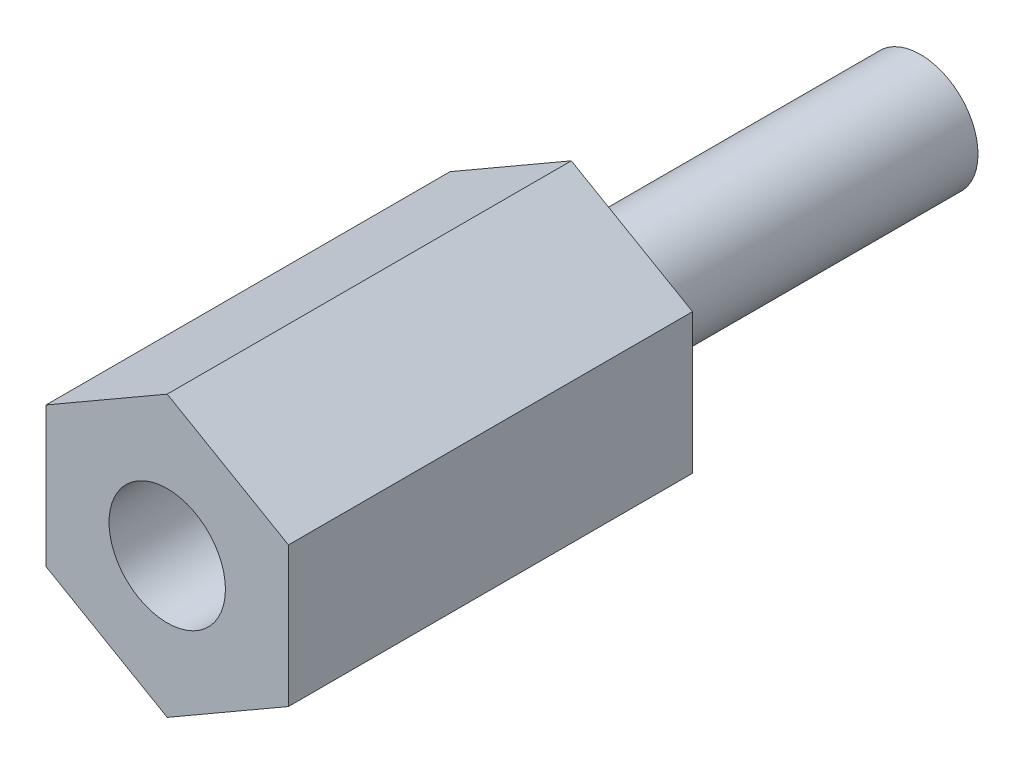
ISO-10303-21;
HEADER;
FILE_DESCRIPTION(('STEP AP214'),'2;1');
FILE_NAME('part.step','',(''),(''),'','','');
FILE_SCHEMA(('AUTOMOTIVE_DESIGN { 1 0 10303 214 1 1 1 1 }'));
ENDSEC;
DATA;
#1=APPLICATION_CONTEXT('core data for automotive mechanical design processes');
#2=APPLICATION_PROTOCOL_DEFINITION('international standard','automotive_design',2000,#1);
#3=PRODUCT_CONTEXT('',#1,'mechanical');
#4=PRODUCT('Part','Part','',(#3));
#5=PRODUCT_RELATED_PRODUCT_CATEGORY('part','',(#4));
#6=PRODUCT_DEFINITION_FORMATION('','',#4);
#7=PRODUCT_DEFINITION_CONTEXT('part definition',#1,'design');
#8=PRODUCT_DEFINITION('design','',#6,#7);
#9=PRODUCT_DEFINITION_SHAPE('','',#8);
#10=(LENGTH_UNIT() NAMED_UNIT(*) SI_UNIT(.MILLI.,.METRE.));
#11=(NAMED_UNIT(*) PLANE_ANGLE_UNIT() SI_UNIT($,.RADIAN.));
#12=(NAMED_UNIT(*) SI_UNIT($,.STERADIAN.) SOLID_ANGLE_UNIT());
#13=UNCERTAINTY_MEASURE_WITH_UNIT(LENGTH_MEASURE(1.E-05),#10,'distance_accuracy_value','');
#14=(GEOMETRIC_REPRESENTATION_CONTEXT(3) GLOBAL_UNCERTAINTY_ASSIGNED_CONTEXT((#13)) GLOBAL_UNIT_ASSIGNED_CONTEXT((#10,
#11,#12)) REPRESENTATION_CONTEXT('',''));
#15=CARTESIAN_POINT('',(0.,0.,0.));
#16=DIRECTION('',(0.,0.,1.));
#17=DIRECTION('',(1.,0.,0.));
#18=AXIS2_PLACEMENT_3D('',#15,#16,#17);
#19=CARTESIAN_POINT('',(0.,0.,0.));
#20=DIRECTION('',(0.,0.,1.));
#21=DIRECTION('',(1.,0.,0.));
#22=AXIS2_PLACEMENT_3D('',#19,#20,#21);
#23=PLANE('',#22);
#24=DIRECTION('',(-0.866025403784438,0.500000000000001,0.));
#25=VECTOR('',#24,1.);
#26=CARTESIAN_POINT('',(2.38125,1.3748153285078,0.));
#27=LINE('',#26,#25);
#28=CARTESIAN_POINT('',(2.38125,1.3748153285078,0.));
#29=VERTEX_POINT('',#28);
#30=CARTESIAN_POINT('',(0.,2.74963065701559,0.));
#31=VERTEX_POINT('',#30);
#32=EDGE_CURVE('E120',#29,#31,#27,.T.);
#33=ORIENTED_EDGE('',*,*,#32,.F.);
#34=DIRECTION('',(0.,1.,0.));
#35=VECTOR('',#34,1.);
#36=CARTESIAN_POINT('',(2.38125,-1.37481532850781,0.));
#37=LINE('',#36,#35);
#38=CARTESIAN_POINT('',(2.38125,-1.37481532850781,0.));
#39=VERTEX_POINT('',#38);
#40=EDGE_CURVE('E80',#39,#29,#37,.T.);
#41=ORIENTED_EDGE('',*,*,#40,.F.);
#42=DIRECTION('',(0.866025403784439,0.5,0.));
#43=VECTOR('',#42,1.);
#44=CARTESIAN_POINT('',(0.,-2.74963065701559,0.));
#45=LINE('',#44,#43);
#46=CARTESIAN_POINT('',(0.,-2.74963065701559,0.));
#47=VERTEX_POINT('',#46);
#48=EDGE_CURVE('E74',#47,#39,#45,.T.);
#49=ORIENTED_EDGE('',*,*,#48,.F.);
#50=DIRECTION('',(0.86602540378444,-0.499999999999998,0.));
#51=VECTOR('',#50,1.);
#52=CARTESIAN_POINT('',(-2.38124999999999,-1.3748153285078,0.));
#53=LINE('',#52,#51);
#54=CARTESIAN_POINT('',(-2.38124999999999,-1.3748153285078,0.));
#55=VERTEX_POINT('',#54);
#56=EDGE_CURVE('E110',#55,#47,#53,.T.);
#57=ORIENTED_EDGE('',*,*,#56,.F.);
#58=DIRECTION('',(0.,-1.,0.));
#59=VECTOR('',#58,1.);
#60=CARTESIAN_POINT('',(-2.38124999999999,1.37481532850779,0.));
#61=LINE('',#60,#59);
#62=CARTESIAN_POINT('',(-2.38124999999999,1.37481532850779,0.));
#63=VERTEX_POINT('',#62);
#64=EDGE_CURVE('E126',#63,#55,#61,.T.);
#65=ORIENTED_EDGE('',*,*,#64,.F.);
#66=DIRECTION('',(-0.866025403784438,-0.500000000000001,0.));
#67=VECTOR('',#66,1.);
#68=CARTESIAN_POINT('',(0.,2.74963065701559,0.));
#69=LINE('',#68,#67);
#70=EDGE_CURVE('E123',#31,#63,#69,.T.);
#71=ORIENTED_EDGE('',*,*,#70,.F.);
#72=EDGE_LOOP('',(#33,#41,#49,#57,#65,#71));
#73=FACE_BOUND('',#72,.T.);
#74=CARTESIAN_POINT('',(0.,0.,0.));
#75=DIRECTION('',(0.,0.,1.));
#76=DIRECTION('',(1.,0.,0.));
#77=AXIS2_PLACEMENT_3D('',#74,#75,#76);
#78=CIRCLE('',#77,1.1303);
#79=CARTESIAN_POINT('',(1.1303,0.,0.));
#80=VERTEX_POINT('',#79);
#81=EDGE_CURVE('E11',#80,#80,#78,.F.);
#82=ORIENTED_EDGE('',*,*,#81,.F.);
#83=EDGE_LOOP('',(#82));
#84=FACE_BOUND('',#83,.T.);
#85=ADVANCED_FACE('F34',(#73,#84),#23,.F.);
#86=CARTESIAN_POINT('',(2.38125,1.3748153285078,7.9375));
#87=DIRECTION('',(-0.500000000000001,-0.866025403784438,0.));
#88=DIRECTION('',(0.866025403784438,-0.500000000000001,0.));
#89=AXIS2_PLACEMENT_3D('',#86,#87,#88);
#90=PLANE('',#89);
#91=ORIENTED_EDGE('',*,*,#32,.T.);
#92=DIRECTION('',(0.,0.,-1.));
#93=VECTOR('',#92,1.);
#94=CARTESIAN_POINT('',(0.,2.74963065701559,7.9375));
#95=LINE('',#94,#93);
#96=CARTESIAN_POINT('',(0.,2.74963065701559,7.9375));
#97=VERTEX_POINT('',#96);
#98=EDGE_CURVE('E43',#97,#31,#95,.T.);
#99=ORIENTED_EDGE('',*,*,#98,.F.);
#100=DIRECTION('',(-0.866025403784438,0.500000000000001,0.));
#101=VECTOR('',#100,1.);
#102=CARTESIAN_POINT('',(2.38125,1.3748153285078,7.9375));
#103=LINE('',#102,#101);
#104=CARTESIAN_POINT('',(2.38125,1.3748153285078,7.9375));
#105=VERTEX_POINT('',#104);
#106=EDGE_CURVE('E131',#105,#97,#103,.T.);
#107=ORIENTED_EDGE('',*,*,#106,.F.);
#108=DIRECTION('',(0.,0.,-1.));
#109=VECTOR('',#108,1.);
#110=CARTESIAN_POINT('',(2.38125,1.3748153285078,7.9375));
#111=LINE('',#110,#109);
#112=EDGE_CURVE('E116',#105,#29,#111,.T.);
#113=ORIENTED_EDGE('',*,*,#112,.T.);
#114=EDGE_LOOP('',(#91,#99,#107,#113));
#115=FACE_BOUND('',#114,.T.);
#116=ADVANCED_FACE('F36',(#115),#90,.F.);
#117=CARTESIAN_POINT('',(0.,2.74963065701559,7.9375));
#118=DIRECTION('',(0.500000000000001,-0.866025403784438,0.));
#119=DIRECTION('',(0.866025403784438,0.500000000000001,0.));
#120=AXIS2_PLACEMENT_3D('',#117,#118,#119);
#121=PLANE('',#120);
#122=ORIENTED_EDGE('',*,*,#70,.T.);
#123=DIRECTION('',(0.,0.,-1.));
#124=VECTOR('',#123,1.);
#125=CARTESIAN_POINT('',(-2.38124999999999,1.37481532850779,7.9375));
#126=LINE('',#125,#124);
#127=CARTESIAN_POINT('',(-2.38124999999999,1.37481532850779,7.9375));
#128=VERTEX_POINT('',#127);
#129=EDGE_CURVE('E135',#128,#63,#126,.T.);
#130=ORIENTED_EDGE('',*,*,#129,.F.);
#131=DIRECTION('',(-0.866025403784438,-0.500000000000001,0.));
#132=VECTOR('',#131,1.);
#133=CARTESIAN_POINT('',(0.,2.74963065701559,7.9375));
#134=LINE('',#133,#132);
#135=EDGE_CURVE('E89',#97,#128,#134,.T.);
#136=ORIENTED_EDGE('',*,*,#135,.F.);
#137=ORIENTED_EDGE('',*,*,#98,.T.);
#138=EDGE_LOOP('',(#122,#130,#136,#137));
#139=FACE_BOUND('',#138,.T.);
#140=ADVANCED_FACE('F138',(#139),#121,.F.);
#141=CARTESIAN_POINT('',(-2.38124999999999,1.37481532850779,7.9375));
#142=DIRECTION('',(1.,0.,0.));
#143=DIRECTION('',(0.,0.,-1.));
#144=AXIS2_PLACEMENT_3D('',#141,#142,#143);
#145=PLANE('',#144);
#146=ORIENTED_EDGE('',*,*,#64,.T.);
#147=DIRECTION('',(0.,0.,-1.));
#148=VECTOR('',#147,1.);
#149=CARTESIAN_POINT('',(-2.38124999999999,-1.3748153285078,7.9375));
#150=LINE('',#149,#148);
#151=CARTESIAN_POINT('',(-2.38124999999999,-1.3748153285078,7.9375));
#152=VERTEX_POINT('',#151);
#153=EDGE_CURVE('E111',#152,#55,#150,.T.);
#154=ORIENTED_EDGE('',*,*,#153,.F.);
#155=DIRECTION('',(0.,-1.,0.));
#156=VECTOR('',#155,1.);
#157=CARTESIAN_POINT('',(-2.38124999999999,1.37481532850779,7.9375));
#158=LINE('',#157,#156);
#159=EDGE_CURVE('E102',#128,#152,#158,.T.);
#160=ORIENTED_EDGE('',*,*,#159,.F.);
#161=ORIENTED_EDGE('',*,*,#129,.T.);
#162=EDGE_LOOP('',(#146,#154,#160,#161));
#163=FACE_BOUND('',#162,.T.);
#164=ADVANCED_FACE('F146',(#163),#145,.F.);
#165=CARTESIAN_POINT('',(-2.38124999999999,-1.3748153285078,7.9375));
#166=DIRECTION('',(0.499999999999998,0.866025403784439,0.));
#167=DIRECTION('',(-0.86602540378444,0.499999999999999,0.));
#168=AXIS2_PLACEMENT_3D('',#165,#166,#167);
#169=PLANE('',#168);
#170=ORIENTED_EDGE('',*,*,#56,.T.);
#171=DIRECTION('',(0.,0.,-1.));
#172=VECTOR('',#171,1.);
#173=CARTESIAN_POINT('',(0.,-2.74963065701559,7.9375));
#174=LINE('',#173,#172);
#175=CARTESIAN_POINT('',(0.,-2.74963065701559,7.9375));
#176=VERTEX_POINT('',#175);
#177=EDGE_CURVE('E107',#176,#47,#174,.T.);
#178=ORIENTED_EDGE('',*,*,#177,.F.);
#179=DIRECTION('',(0.86602540378444,-0.499999999999998,0.));
#180=VECTOR('',#179,1.);
#181=CARTESIAN_POINT('',(-2.38124999999999,-1.3748153285078,7.9375));
#182=LINE('',#181,#180);
#183=EDGE_CURVE('E96',#152,#176,#182,.T.);
#184=ORIENTED_EDGE('',*,*,#183,.F.);
#185=ORIENTED_EDGE('',*,*,#153,.T.);
#186=EDGE_LOOP('',(#170,#178,#184,#185));
#187=FACE_BOUND('',#186,.T.);
#188=ADVANCED_FACE('F108',(#187),#169,.F.);
#189=CARTESIAN_POINT('',(0.,-2.74963065701559,7.9375));
#190=DIRECTION('',(-0.5,0.866025403784439,0.));
#191=DIRECTION('',(-0.866025403784439,-0.5,0.));
#192=AXIS2_PLACEMENT_3D('',#189,#190,#191);
#193=PLANE('',#192);
#194=ORIENTED_EDGE('',*,*,#48,.T.);
#195=DIRECTION('',(0.,0.,-1.));
#196=VECTOR('',#195,1.);
#197=CARTESIAN_POINT('',(2.38125,-1.37481532850781,7.9375));
#198=LINE('',#197,#196);
#199=CARTESIAN_POINT('',(2.38125,-1.37481532850781,7.9375));
#200=VERTEX_POINT('',#199);
#201=EDGE_CURVE('E112',#200,#39,#198,.T.);
#202=ORIENTED_EDGE('',*,*,#201,.F.);
#203=DIRECTION('',(0.866025403784439,0.5,0.));
#204=VECTOR('',#203,1.);
#205=CARTESIAN_POINT('',(0.,-2.74963065701559,7.9375));
#206=LINE('',#205,#204);
#207=EDGE_CURVE('E100',#176,#200,#206,.T.);
#208=ORIENTED_EDGE('',*,*,#207,.F.);
#209=ORIENTED_EDGE('',*,*,#177,.T.);
#210=EDGE_LOOP('',(#194,#202,#208,#209));
#211=FACE_BOUND('',#210,.T.);
#212=ADVANCED_FACE('F114',(#211),#193,.F.);
#213=CARTESIAN_POINT('',(2.38125,-1.37481532850781,7.9375));
#214=DIRECTION('',(-1.,0.,0.));
#215=DIRECTION('',(0.,-1.,0.));
#216=AXIS2_PLACEMENT_3D('',#213,#214,#215);
#217=PLANE('',#216);
#218=ORIENTED_EDGE('',*,*,#40,.T.);
#219=ORIENTED_EDGE('',*,*,#112,.F.);
#220=DIRECTION('',(0.,1.,0.));
#221=VECTOR('',#220,1.);
#222=CARTESIAN_POINT('',(2.38125,-1.37481532850781,7.9375));
#223=LINE('',#222,#221);
#224=EDGE_CURVE('E51',#200,#105,#223,.T.);
#225=ORIENTED_EDGE('',*,*,#224,.F.);
#226=ORIENTED_EDGE('',*,*,#201,.T.);
#227=EDGE_LOOP('',(#218,#219,#225,#226));
#228=FACE_BOUND('',#227,.T.);
#229=ADVANCED_FACE('F170',(#228),#217,.F.);
#230=CARTESIAN_POINT('',(0.,0.,7.9375));
#231=DIRECTION('',(0.,0.,1.));
#232=DIRECTION('',(1.,0.,0.));
#233=AXIS2_PLACEMENT_3D('',#230,#231,#232);
#234=PLANE('',#233);
#235=CARTESIAN_POINT('',(0.,0.,7.9375));
#236=DIRECTION('',(0.,0.,1.));
#237=DIRECTION('',(1.,0.,0.));
#238=AXIS2_PLACEMENT_3D('',#235,#236,#237);
#239=CIRCLE('',#238,1.143);
#240=CARTESIAN_POINT('',(1.143,0.,7.9375));
#241=VERTEX_POINT('',#240);
#242=EDGE_CURVE('E153',#241,#241,#239,.T.);
#243=ORIENTED_EDGE('',*,*,#242,.F.);
#244=EDGE_LOOP('',(#243));
#245=FACE_BOUND('',#244,.T.);
#246=ORIENTED_EDGE('',*,*,#106,.T.);
#247=ORIENTED_EDGE('',*,*,#135,.T.);
#248=ORIENTED_EDGE('',*,*,#159,.T.);
#249=ORIENTED_EDGE('',*,*,#183,.T.);
#250=ORIENTED_EDGE('',*,*,#207,.T.);
#251=ORIENTED_EDGE('',*,*,#224,.T.);
#252=EDGE_LOOP('',(#246,#247,#248,#249,#250,#251));
#253=FACE_BOUND('',#252,.T.);
#254=ADVANCED_FACE('F98',(#245,#253),#234,.T.);
#255=CARTESIAN_POINT('',(0.,0.,-6.858));
#256=DIRECTION('',(0.,0.,1.));
#257=DIRECTION('',(1.,0.,0.));
#258=AXIS2_PLACEMENT_3D('',#255,#256,#257);
#259=CYLINDRICAL_SURFACE('',#258,1.1303);
#260=CARTESIAN_POINT('',(0.,0.,-6.858));
#261=DIRECTION('',(0.,0.,-1.));
#262=DIRECTION('',(-1.,0.,0.));
#263=AXIS2_PLACEMENT_3D('',#260,#261,#262);
#264=CIRCLE('',#263,1.1303);
#265=CARTESIAN_POINT('',(-1.1303,0.,-6.858));
#266=VERTEX_POINT('',#265);
#267=EDGE_CURVE('E124',#266,#266,#264,.T.);
#268=ORIENTED_EDGE('',*,*,#267,.F.);
#269=EDGE_LOOP('',(#268));
#270=FACE_BOUND('',#269,.T.);
#271=ORIENTED_EDGE('',*,*,#81,.T.);
#272=EDGE_LOOP('',(#271));
#273=FACE_BOUND('',#272,.T.);
#274=ADVANCED_FACE('F169',(#270,#273),#259,.T.);
#275=CARTESIAN_POINT('',(0.,0.,-6.858));
#276=DIRECTION('',(0.,0.,-1.));
#277=DIRECTION('',(-1.,0.,0.));
#278=AXIS2_PLACEMENT_3D('',#275,#276,#277);
#279=PLANE('',#278);
#280=ORIENTED_EDGE('',*,*,#267,.T.);
#281=EDGE_LOOP('',(#280));
#282=FACE_BOUND('',#281,.T.);
#283=ADVANCED_FACE('F164',(#282),#279,.T.);
#284=CARTESIAN_POINT('',(0.,0.,5.3975));
#285=DIRECTION('',(0.,0.,1.));
#286=DIRECTION('',(1.,0.,0.));
#287=AXIS2_PLACEMENT_3D('',#284,#285,#286);
#288=CYLINDRICAL_SURFACE('',#287,1.143);
#289=CARTESIAN_POINT('',(0.,0.,5.3975));
#290=DIRECTION('',(0.,0.,1.));
#291=DIRECTION('',(1.,0.,0.));
#292=AXIS2_PLACEMENT_3D('',#289,#290,#291);
#293=CIRCLE('',#292,1.143);
#294=CARTESIAN_POINT('',(1.143,0.,5.3975));
#295=VERTEX_POINT('',#294);
#296=EDGE_CURVE('E152',#295,#295,#293,.T.);
#297=ORIENTED_EDGE('',*,*,#296,.F.);
#298=EDGE_LOOP('',(#297));
#299=FACE_BOUND('',#298,.T.);
#300=ORIENTED_EDGE('',*,*,#242,.T.);
#301=EDGE_LOOP('',(#300));
#302=FACE_BOUND('',#301,.T.);
#303=ADVANCED_FACE('F161',(#299,#302),#288,.F.);
#304=CARTESIAN_POINT('',(0.,0.,5.3975));
#305=DIRECTION('',(0.,0.,1.));
#306=DIRECTION('',(1.,0.,0.));
#307=AXIS2_PLACEMENT_3D('',#304,#305,#306);
#308=PLANE('',#307);
#309=ORIENTED_EDGE('',*,*,#296,.T.);
#310=EDGE_LOOP('',(#309));
#311=FACE_BOUND('',#310,.T.);
#312=ADVANCED_FACE('F159',(#311),#308,.T.);
#313=CLOSED_SHELL('',(#85,#116,#140,#164,#188,#212,#229,#254,#274,#283,#303,#312));
#314=MANIFOLD_SOLID_BREP('B2',#313);
#315=ADVANCED_BREP_SHAPE_REPRESENTATION('',(#18,#314),#14);
#316=SHAPE_DEFINITION_REPRESENTATION(#9,#315);
ENDSEC;
END-ISO-10303-21;
